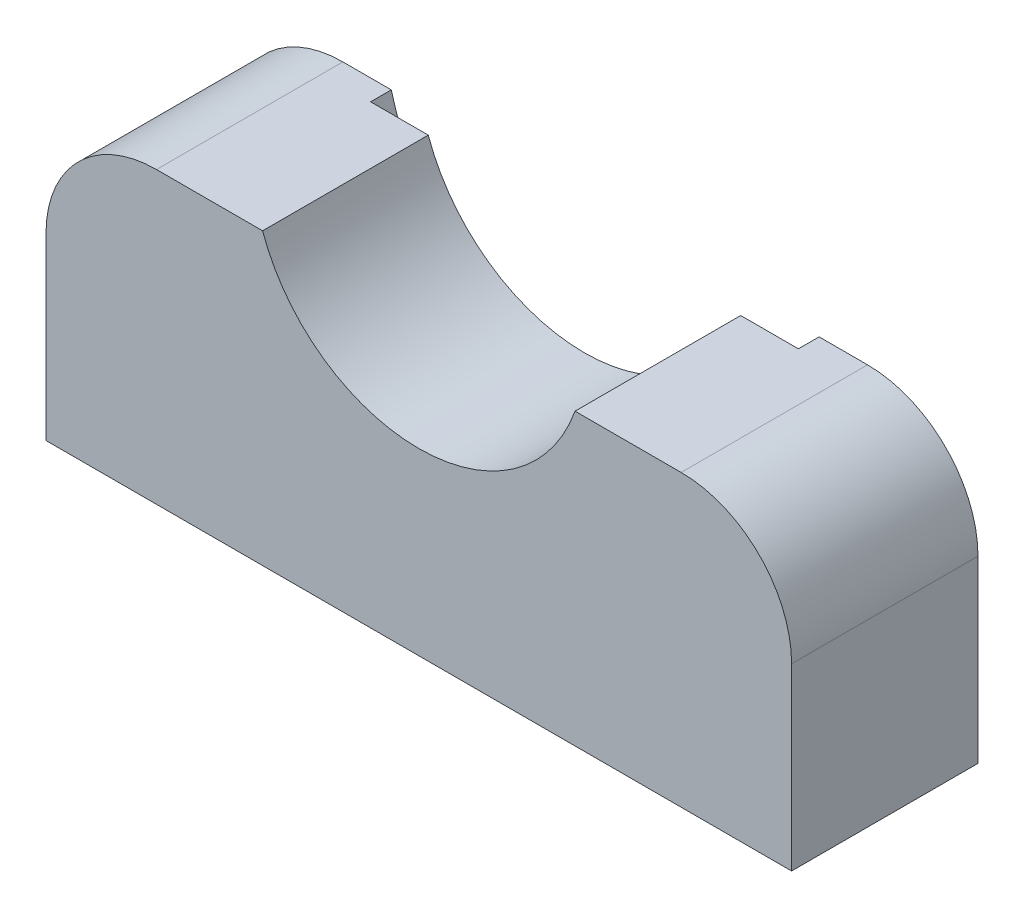
ISO-10303-21;
HEADER;
FILE_DESCRIPTION(('STEP AP214'),'2;1');
FILE_NAME('part.step','',(''),(''),'','','');
FILE_SCHEMA(('AUTOMOTIVE_DESIGN { 1 0 10303 214 1 1 1 1 }'));
ENDSEC;
DATA;
#1=APPLICATION_CONTEXT('core data for automotive mechanical design processes');
#2=APPLICATION_PROTOCOL_DEFINITION('international standard','automotive_design',2000,#1);
#3=PRODUCT_CONTEXT('',#1,'mechanical');
#4=PRODUCT('Part','Part','',(#3));
#5=PRODUCT_RELATED_PRODUCT_CATEGORY('part','',(#4));
#6=PRODUCT_DEFINITION_FORMATION('','',#4);
#7=PRODUCT_DEFINITION_CONTEXT('part definition',#1,'design');
#8=PRODUCT_DEFINITION('design','',#6,#7);
#9=PRODUCT_DEFINITION_SHAPE('','',#8);
#10=(LENGTH_UNIT() NAMED_UNIT(*) SI_UNIT(.MILLI.,.METRE.));
#11=(NAMED_UNIT(*) PLANE_ANGLE_UNIT() SI_UNIT($,.RADIAN.));
#12=(NAMED_UNIT(*) SI_UNIT($,.STERADIAN.) SOLID_ANGLE_UNIT());
#13=UNCERTAINTY_MEASURE_WITH_UNIT(LENGTH_MEASURE(1.E-05),#10,'distance_accuracy_value','');
#14=(GEOMETRIC_REPRESENTATION_CONTEXT(3) GLOBAL_UNCERTAINTY_ASSIGNED_CONTEXT((#13)) GLOBAL_UNIT_ASSIGNED_CONTEXT((#10,
#11,#12)) REPRESENTATION_CONTEXT('',''));
#15=CARTESIAN_POINT('',(0.,0.,0.));
#16=DIRECTION('',(0.,0.,1.));
#17=DIRECTION('',(1.,0.,0.));
#18=AXIS2_PLACEMENT_3D('',#15,#16,#17);
#19=CARTESIAN_POINT('',(-13.5,12.5,6.75));
#20=DIRECTION('',(0.,0.,-1.));
#21=DIRECTION('',(-1.,0.,0.));
#22=AXIS2_PLACEMENT_3D('',#19,#20,#21);
#23=CYLINDRICAL_SURFACE('',#22,6.);
#24=DIRECTION('',(0.,0.,-1.));
#25=VECTOR('',#24,1.);
#26=CARTESIAN_POINT('',(-19.1568542494924,10.5,6.75));
#27=LINE('',#26,#25);
#28=CARTESIAN_POINT('',(-19.1568542494924,10.5,6.75));
#29=VERTEX_POINT('',#28);
#30=CARTESIAN_POINT('',(-19.1568542494924,10.5,0.75));
#31=VERTEX_POINT('',#30);
#32=EDGE_CURVE('E118',#29,#31,#27,.T.);
#33=ORIENTED_EDGE('',*,*,#32,.F.);
#34=CARTESIAN_POINT('',(-13.5,12.5,6.75));
#35=DIRECTION('',(0.,0.,1.));
#36=DIRECTION('',(1.,0.,0.));
#37=AXIS2_PLACEMENT_3D('',#34,#35,#36);
#38=CIRCLE('',#37,6.);
#39=CARTESIAN_POINT('',(-7.84314575050762,10.5,6.75));
#40=VERTEX_POINT('',#39);
#41=EDGE_CURVE('E131',#29,#40,#38,.T.);
#42=ORIENTED_EDGE('',*,*,#41,.T.);
#43=DIRECTION('',(0.,0.,-1.));
#44=VECTOR('',#43,1.);
#45=CARTESIAN_POINT('',(-7.84314575050762,10.5,6.75));
#46=LINE('',#45,#44);
#47=CARTESIAN_POINT('',(-7.84314575050762,10.5,0.75));
#48=VERTEX_POINT('',#47);
#49=EDGE_CURVE('E306',#48,#40,#46,.F.);
#50=ORIENTED_EDGE('',*,*,#49,.F.);
#51=CARTESIAN_POINT('',(-13.5,12.5,0.75));
#52=DIRECTION('',(0.,0.,-1.));
#53=DIRECTION('',(-1.,0.,0.));
#54=AXIS2_PLACEMENT_3D('',#51,#52,#53);
#55=CIRCLE('',#54,6.);
#56=EDGE_CURVE('E133',#48,#31,#55,.T.);
#57=ORIENTED_EDGE('',*,*,#56,.T.);
#58=EDGE_LOOP('',(#33,#42,#50,#57));
#59=FACE_BOUND('',#58,.T.);
#60=ADVANCED_FACE('F37',(#59),#23,.F.);
#61=CARTESIAN_POINT('',(-27.,0.,6.75));
#62=DIRECTION('',(-1.,0.,0.));
#63=DIRECTION('',(0.,-1.,0.));
#64=AXIS2_PLACEMENT_3D('',#61,#62,#63);
#65=PLANE('',#64);
#66=DIRECTION('',(0.,1.,0.));
#67=VECTOR('',#66,1.);
#68=CARTESIAN_POINT('',(-27.,0.,6.75));
#69=LINE('',#68,#67);
#70=CARTESIAN_POINT('',(-27.,0.,6.75));
#71=VERTEX_POINT('',#70);
#72=CARTESIAN_POINT('',(-27.,6.5,6.75));
#73=VERTEX_POINT('',#72);
#74=EDGE_CURVE('E139',#71,#73,#69,.T.);
#75=ORIENTED_EDGE('',*,*,#74,.T.);
#76=DIRECTION('',(0.,0.,1.));
#77=VECTOR('',#76,1.);
#78=CARTESIAN_POINT('',(-27.,6.5,0.));
#79=LINE('',#78,#77);
#80=CARTESIAN_POINT('',(-27.,6.5,0.));
#81=VERTEX_POINT('',#80);
#82=EDGE_CURVE('E178',#73,#81,#79,.F.);
#83=ORIENTED_EDGE('',*,*,#82,.T.);
#84=DIRECTION('',(0.,1.,0.));
#85=VECTOR('',#84,1.);
#86=CARTESIAN_POINT('',(-27.,0.,0.));
#87=LINE('',#86,#85);
#88=CARTESIAN_POINT('',(-27.,0.,0.));
#89=VERTEX_POINT('',#88);
#90=EDGE_CURVE('E156',#89,#81,#87,.T.);
#91=ORIENTED_EDGE('',*,*,#90,.F.);
#92=DIRECTION('',(0.,0.,-1.));
#93=VECTOR('',#92,1.);
#94=CARTESIAN_POINT('',(-27.,0.,6.75));
#95=LINE('',#94,#93);
#96=EDGE_CURVE('E162',#71,#89,#95,.T.);
#97=ORIENTED_EDGE('',*,*,#96,.F.);
#98=EDGE_LOOP('',(#75,#83,#91,#97));
#99=FACE_BOUND('',#98,.T.);
#100=ADVANCED_FACE('F200',(#99),#65,.T.);
#101=CARTESIAN_POINT('',(0.,0.,6.75));
#102=DIRECTION('',(0.,-1.,0.));
#103=DIRECTION('',(1.,0.,0.));
#104=AXIS2_PLACEMENT_3D('',#101,#102,#103);
#105=PLANE('',#104);
#106=DIRECTION('',(-1.,0.,0.));
#107=VECTOR('',#106,1.);
#108=CARTESIAN_POINT('',(0.,0.,0.));
#109=LINE('',#108,#107);
#110=CARTESIAN_POINT('',(0.,0.,0.));
#111=VERTEX_POINT('',#110);
#112=EDGE_CURVE('E145',#111,#89,#109,.T.);
#113=ORIENTED_EDGE('',*,*,#112,.F.);
#114=DIRECTION('',(0.,0.,-1.));
#115=VECTOR('',#114,1.);
#116=CARTESIAN_POINT('',(0.,0.,6.75));
#117=LINE('',#116,#115);
#118=CARTESIAN_POINT('',(0.,0.,6.75));
#119=VERTEX_POINT('',#118);
#120=EDGE_CURVE('E155',#119,#111,#117,.T.);
#121=ORIENTED_EDGE('',*,*,#120,.F.);
#122=DIRECTION('',(-1.,0.,0.));
#123=VECTOR('',#122,1.);
#124=CARTESIAN_POINT('',(0.,0.,6.75));
#125=LINE('',#124,#123);
#126=EDGE_CURVE('E143',#119,#71,#125,.T.);
#127=ORIENTED_EDGE('',*,*,#126,.T.);
#128=ORIENTED_EDGE('',*,*,#96,.T.);
#129=EDGE_LOOP('',(#113,#121,#127,#128));
#130=FACE_BOUND('',#129,.T.);
#131=ADVANCED_FACE('F192',(#130),#105,.T.);
#132=CARTESIAN_POINT('',(0.,0.,6.75));
#133=DIRECTION('',(-1.,0.,0.));
#134=DIRECTION('',(0.,0.,1.));
#135=AXIS2_PLACEMENT_3D('',#132,#133,#134);
#136=PLANE('',#135);
#137=DIRECTION('',(0.,1.,0.));
#138=VECTOR('',#137,1.);
#139=CARTESIAN_POINT('',(0.,0.,0.));
#140=LINE('',#139,#138);
#141=CARTESIAN_POINT('',(0.,6.5,0.));
#142=VERTEX_POINT('',#141);
#143=EDGE_CURVE('E140',#111,#142,#140,.T.);
#144=ORIENTED_EDGE('',*,*,#143,.T.);
#145=DIRECTION('',(0.,0.,1.));
#146=VECTOR('',#145,1.);
#147=CARTESIAN_POINT('',(0.,6.5,6.75));
#148=LINE('',#147,#146);
#149=CARTESIAN_POINT('',(0.,6.5,6.75));
#150=VERTEX_POINT('',#149);
#151=EDGE_CURVE('E45',#142,#150,#148,.T.);
#152=ORIENTED_EDGE('',*,*,#151,.T.);
#153=DIRECTION('',(0.,1.,0.));
#154=VECTOR('',#153,1.);
#155=CARTESIAN_POINT('',(0.,0.,6.75));
#156=LINE('',#155,#154);
#157=EDGE_CURVE('E152',#119,#150,#156,.T.);
#158=ORIENTED_EDGE('',*,*,#157,.F.);
#159=ORIENTED_EDGE('',*,*,#120,.T.);
#160=EDGE_LOOP('',(#144,#152,#158,#159));
#161=FACE_BOUND('',#160,.T.);
#162=ADVANCED_FACE('F186',(#161),#136,.F.);
#163=CARTESIAN_POINT('',(0.,0.,6.75));
#164=DIRECTION('',(0.,0.,1.));
#165=DIRECTION('',(1.,0.,0.));
#166=AXIS2_PLACEMENT_3D('',#163,#164,#165);
#167=PLANE('',#166);
#168=DIRECTION('',(1.,0.,0.));
#169=VECTOR('',#168,1.);
#170=CARTESIAN_POINT('',(0.,10.5,6.75));
#171=LINE('',#170,#169);
#172=CARTESIAN_POINT('',(-23.,10.5,6.75));
#173=VERTEX_POINT('',#172);
#174=EDGE_CURVE('E114',#173,#29,#171,.T.);
#175=ORIENTED_EDGE('',*,*,#174,.F.);
#176=CARTESIAN_POINT('',(-23.,6.5,6.75));
#177=DIRECTION('',(0.,0.,1.));
#178=DIRECTION('',(1.,0.,0.));
#179=AXIS2_PLACEMENT_3D('',#176,#177,#178);
#180=CIRCLE('',#179,4.);
#181=EDGE_CURVE('E176',#173,#73,#180,.T.);
#182=ORIENTED_EDGE('',*,*,#181,.T.);
#183=ORIENTED_EDGE('',*,*,#74,.F.);
#184=ORIENTED_EDGE('',*,*,#126,.F.);
#185=ORIENTED_EDGE('',*,*,#157,.T.);
#186=CARTESIAN_POINT('',(-4.,6.5,6.75));
#187=DIRECTION('',(0.,0.,1.));
#188=DIRECTION('',(1.,0.,0.));
#189=AXIS2_PLACEMENT_3D('',#186,#187,#188);
#190=CIRCLE('',#189,4.);
#191=CARTESIAN_POINT('',(-4.,10.5,6.75));
#192=VERTEX_POINT('',#191);
#193=EDGE_CURVE('E174',#150,#192,#190,.T.);
#194=ORIENTED_EDGE('',*,*,#193,.T.);
#195=EDGE_CURVE('E125',#40,#192,#171,.T.);
#196=ORIENTED_EDGE('',*,*,#195,.F.);
#197=ORIENTED_EDGE('',*,*,#41,.F.);
#198=EDGE_LOOP('',(#175,#182,#183,#184,#185,#194,#196,#197));
#199=FACE_BOUND('',#198,.T.);
#200=ADVANCED_FACE('F138',(#199),#167,.T.);
#201=CARTESIAN_POINT('',(0.,0.,0.));
#202=DIRECTION('',(0.,0.,1.));
#203=DIRECTION('',(1.,0.,0.));
#204=AXIS2_PLACEMENT_3D('',#201,#202,#203);
#205=PLANE('',#204);
#206=ORIENTED_EDGE('',*,*,#90,.T.);
#207=CARTESIAN_POINT('',(-23.,6.5,0.));
#208=DIRECTION('',(0.,0.,1.));
#209=DIRECTION('',(1.,0.,0.));
#210=AXIS2_PLACEMENT_3D('',#207,#208,#209);
#211=CIRCLE('',#210,4.);
#212=CARTESIAN_POINT('',(-23.,10.5,0.));
#213=VERTEX_POINT('',#212);
#214=EDGE_CURVE('E181',#81,#213,#211,.F.);
#215=ORIENTED_EDGE('',*,*,#214,.T.);
#216=DIRECTION('',(1.,0.,0.));
#217=VECTOR('',#216,1.);
#218=CARTESIAN_POINT('',(0.,10.5,0.));
#219=LINE('',#218,#217);
#220=CARTESIAN_POINT('',(-21.2459666924148,10.5,0.));
#221=VERTEX_POINT('',#220);
#222=EDGE_CURVE('E135',#213,#221,#219,.T.);
#223=ORIENTED_EDGE('',*,*,#222,.T.);
#224=CARTESIAN_POINT('',(-13.5,12.5,0.));
#225=DIRECTION('',(0.,0.,1.));
#226=DIRECTION('',(1.,0.,0.));
#227=AXIS2_PLACEMENT_3D('',#224,#225,#226);
#228=CIRCLE('',#227,8.);
#229=CARTESIAN_POINT('',(-5.75403330758517,10.5,0.));
#230=VERTEX_POINT('',#229);
#231=EDGE_CURVE('E164',#221,#230,#228,.T.);
#232=ORIENTED_EDGE('',*,*,#231,.T.);
#233=CARTESIAN_POINT('',(-4.,10.5,0.));
#234=VERTEX_POINT('',#233);
#235=EDGE_CURVE('E303',#230,#234,#219,.T.);
#236=ORIENTED_EDGE('',*,*,#235,.T.);
#237=CARTESIAN_POINT('',(-4.,6.5,0.));
#238=DIRECTION('',(0.,0.,1.));
#239=DIRECTION('',(1.,0.,0.));
#240=AXIS2_PLACEMENT_3D('',#237,#238,#239);
#241=CIRCLE('',#240,4.);
#242=EDGE_CURVE('E52',#234,#142,#241,.F.);
#243=ORIENTED_EDGE('',*,*,#242,.T.);
#244=ORIENTED_EDGE('',*,*,#143,.F.);
#245=ORIENTED_EDGE('',*,*,#112,.T.);
#246=EDGE_LOOP('',(#206,#215,#223,#232,#236,#243,#244,#245));
#247=FACE_BOUND('',#246,.T.);
#248=ADVANCED_FACE('F194',(#247),#205,.F.);
#249=CARTESIAN_POINT('',(-13.5,12.5,0.75));
#250=DIRECTION('',(0.,0.,-1.));
#251=DIRECTION('',(-1.,0.,0.));
#252=AXIS2_PLACEMENT_3D('',#249,#250,#251);
#253=PLANE('',#252);
#254=DIRECTION('',(-1.,0.,0.));
#255=VECTOR('',#254,1.);
#256=CARTESIAN_POINT('',(-13.5,10.5,0.75));
#257=LINE('',#256,#255);
#258=CARTESIAN_POINT('',(-5.75403330758517,10.5,0.75));
#259=VERTEX_POINT('',#258);
#260=EDGE_CURVE('E124',#259,#48,#257,.T.);
#261=ORIENTED_EDGE('',*,*,#260,.F.);
#262=CARTESIAN_POINT('',(-13.5,12.5,0.75));
#263=DIRECTION('',(0.,0.,-1.));
#264=DIRECTION('',(-1.,0.,0.));
#265=AXIS2_PLACEMENT_3D('',#262,#263,#264);
#266=CIRCLE('',#265,8.);
#267=CARTESIAN_POINT('',(-21.2459666924148,10.5,0.75));
#268=VERTEX_POINT('',#267);
#269=EDGE_CURVE('E134',#259,#268,#266,.T.);
#270=ORIENTED_EDGE('',*,*,#269,.T.);
#271=EDGE_CURVE('E304',#31,#268,#257,.T.);
#272=ORIENTED_EDGE('',*,*,#271,.F.);
#273=ORIENTED_EDGE('',*,*,#56,.F.);
#274=EDGE_LOOP('',(#261,#270,#272,#273));
#275=FACE_BOUND('',#274,.T.);
#276=ADVANCED_FACE('F222',(#275),#253,.T.);
#277=CARTESIAN_POINT('',(-13.5,12.5,0.75));
#278=DIRECTION('',(0.,0.,-1.));
#279=DIRECTION('',(-1.,0.,0.));
#280=AXIS2_PLACEMENT_3D('',#277,#278,#279);
#281=CYLINDRICAL_SURFACE('',#280,8.);
#282=ORIENTED_EDGE('',*,*,#231,.F.);
#283=DIRECTION('',(0.,0.,-1.));
#284=VECTOR('',#283,1.);
#285=CARTESIAN_POINT('',(-21.2459666924148,10.5,0.75));
#286=LINE('',#285,#284);
#287=EDGE_CURVE('E170',#221,#268,#286,.F.);
#288=ORIENTED_EDGE('',*,*,#287,.T.);
#289=ORIENTED_EDGE('',*,*,#269,.F.);
#290=DIRECTION('',(0.,0.,-1.));
#291=VECTOR('',#290,1.);
#292=CARTESIAN_POINT('',(-5.75403330758517,10.5,0.75));
#293=LINE('',#292,#291);
#294=EDGE_CURVE('E167',#259,#230,#293,.T.);
#295=ORIENTED_EDGE('',*,*,#294,.T.);
#296=EDGE_LOOP('',(#282,#288,#289,#295));
#297=FACE_BOUND('',#296,.T.);
#298=ADVANCED_FACE('F220',(#297),#281,.F.);
#299=CARTESIAN_POINT('',(0.,10.5,-2.25));
#300=DIRECTION('',(0.,-1.,0.));
#301=DIRECTION('',(1.,0.,0.));
#302=AXIS2_PLACEMENT_3D('',#299,#300,#301);
#303=PLANE('',#302);
#304=ORIENTED_EDGE('',*,*,#195,.T.);
#305=DIRECTION('',(0.,0.,1.));
#306=VECTOR('',#305,1.);
#307=CARTESIAN_POINT('',(-4.,10.5,-2.25));
#308=LINE('',#307,#306);
#309=EDGE_CURVE('E11',#192,#234,#308,.F.);
#310=ORIENTED_EDGE('',*,*,#309,.T.);
#311=ORIENTED_EDGE('',*,*,#235,.F.);
#312=ORIENTED_EDGE('',*,*,#294,.F.);
#313=ORIENTED_EDGE('',*,*,#260,.T.);
#314=ORIENTED_EDGE('',*,*,#49,.T.);
#315=EDGE_LOOP('',(#304,#310,#311,#312,#313,#314));
#316=FACE_BOUND('',#315,.T.);
#317=ADVANCED_FACE('F215',(#316),#303,.F.);
#318=ORIENTED_EDGE('',*,*,#222,.F.);
#319=DIRECTION('',(0.,0.,1.));
#320=VECTOR('',#319,1.);
#321=CARTESIAN_POINT('',(-23.,10.5,6.75));
#322=LINE('',#321,#320);
#323=EDGE_CURVE('E121',#213,#173,#322,.T.);
#324=ORIENTED_EDGE('',*,*,#323,.T.);
#325=ORIENTED_EDGE('',*,*,#174,.T.);
#326=ORIENTED_EDGE('',*,*,#32,.T.);
#327=ORIENTED_EDGE('',*,*,#271,.T.);
#328=ORIENTED_EDGE('',*,*,#287,.F.);
#329=EDGE_LOOP('',(#318,#324,#325,#326,#327,#328));
#330=FACE_BOUND('',#329,.T.);
#331=ADVANCED_FACE('F117',(#330),#303,.F.);
#332=CARTESIAN_POINT('',(-23.,6.5,-2.25));
#333=DIRECTION('',(0.,0.,-1.));
#334=DIRECTION('',(-1.,0.,0.));
#335=AXIS2_PLACEMENT_3D('',#332,#333,#334);
#336=CYLINDRICAL_SURFACE('',#335,4.);
#337=ORIENTED_EDGE('',*,*,#214,.F.);
#338=ORIENTED_EDGE('',*,*,#82,.F.);
#339=ORIENTED_EDGE('',*,*,#181,.F.);
#340=ORIENTED_EDGE('',*,*,#323,.F.);
#341=EDGE_LOOP('',(#337,#338,#339,#340));
#342=FACE_BOUND('',#341,.T.);
#343=ADVANCED_FACE('F199',(#342),#336,.T.);
#344=CARTESIAN_POINT('',(-4.,6.5,6.75));
#345=DIRECTION('',(0.,0.,1.));
#346=DIRECTION('',(1.,0.,0.));
#347=AXIS2_PLACEMENT_3D('',#344,#345,#346);
#348=CYLINDRICAL_SURFACE('',#347,4.);
#349=ORIENTED_EDGE('',*,*,#242,.F.);
#350=ORIENTED_EDGE('',*,*,#309,.F.);
#351=ORIENTED_EDGE('',*,*,#193,.F.);
#352=ORIENTED_EDGE('',*,*,#151,.F.);
#353=EDGE_LOOP('',(#349,#350,#351,#352));
#354=FACE_BOUND('',#353,.T.);
#355=ADVANCED_FACE('F39',(#354),#348,.T.);
#356=CLOSED_SHELL('',(#60,#100,#131,#162,#200,#248,#276,#298,#317,#331,#343,#355));
#357=MANIFOLD_SOLID_BREP('B2',#356);
#358=ADVANCED_BREP_SHAPE_REPRESENTATION('',(#18,#357),#14);
#359=SHAPE_DEFINITION_REPRESENTATION(#9,#358);
ENDSEC;
END-ISO-10303-21;
